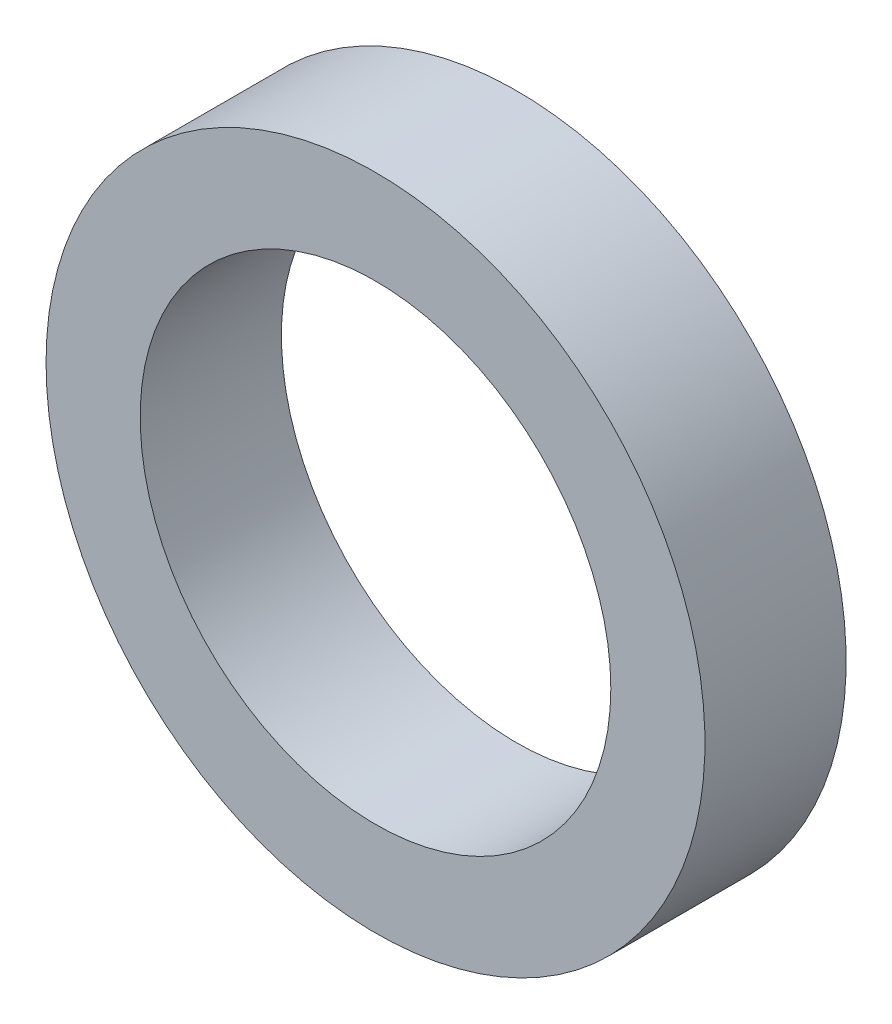
ISO-10303-21;
HEADER;
FILE_DESCRIPTION(('STEP AP214'),'2;1');
FILE_NAME('part.step','',(''),(''),'','','');
FILE_SCHEMA(('AUTOMOTIVE_DESIGN { 1 0 10303 214 1 1 1 1 }'));
ENDSEC;
DATA;
#1=APPLICATION_CONTEXT('core data for automotive mechanical design processes');
#2=APPLICATION_PROTOCOL_DEFINITION('international standard','automotive_design',2000,#1);
#3=PRODUCT_CONTEXT('',#1,'mechanical');
#4=PRODUCT('Part','Part','',(#3));
#5=PRODUCT_RELATED_PRODUCT_CATEGORY('part','',(#4));
#6=PRODUCT_DEFINITION_FORMATION('','',#4);
#7=PRODUCT_DEFINITION_CONTEXT('part definition',#1,'design');
#8=PRODUCT_DEFINITION('design','',#6,#7);
#9=PRODUCT_DEFINITION_SHAPE('','',#8);
#10=(LENGTH_UNIT() NAMED_UNIT(*) SI_UNIT(.MILLI.,.METRE.));
#11=(NAMED_UNIT(*) PLANE_ANGLE_UNIT() SI_UNIT($,.RADIAN.));
#12=(NAMED_UNIT(*) SI_UNIT($,.STERADIAN.) SOLID_ANGLE_UNIT());
#13=UNCERTAINTY_MEASURE_WITH_UNIT(LENGTH_MEASURE(1.E-05),#10,'distance_accuracy_value','');
#14=(GEOMETRIC_REPRESENTATION_CONTEXT(3) GLOBAL_UNCERTAINTY_ASSIGNED_CONTEXT((#13)) GLOBAL_UNIT_ASSIGNED_CONTEXT((#10,
#11,#12)) REPRESENTATION_CONTEXT('',''));
#15=CARTESIAN_POINT('',(0.,0.,0.));
#16=DIRECTION('',(0.,0.,1.));
#17=DIRECTION('',(1.,0.,0.));
#18=AXIS2_PLACEMENT_3D('',#15,#16,#17);
#19=CARTESIAN_POINT('',(0.,0.,2.38125));
#20=DIRECTION('',(0.,0.,1.));
#21=DIRECTION('',(1.,0.,0.));
#22=AXIS2_PLACEMENT_3D('',#19,#20,#21);
#23=PLANE('',#22);
#24=CARTESIAN_POINT('',(0.,0.,2.38125));
#25=DIRECTION('',(0.,0.,1.));
#26=DIRECTION('',(1.,0.,0.));
#27=AXIS2_PLACEMENT_3D('',#24,#25,#26);
#28=CIRCLE('',#27,7.9375);
#29=CARTESIAN_POINT('',(7.9375,0.,2.38125));
#30=VERTEX_POINT('',#29);
#31=EDGE_CURVE('E59',#30,#30,#28,.T.);
#32=ORIENTED_EDGE('',*,*,#31,.F.);
#33=EDGE_LOOP('',(#32));
#34=FACE_BOUND('',#33,.T.);
#35=CARTESIAN_POINT('',(0.,0.,2.38125));
#36=DIRECTION('',(0.,0.,1.));
#37=DIRECTION('',(1.,0.,0.));
#38=AXIS2_PLACEMENT_3D('',#35,#36,#37);
#39=CIRCLE('',#38,11.1125);
#40=CARTESIAN_POINT('',(-11.1125,0.,2.38125));
#41=VERTEX_POINT('',#40);
#42=EDGE_CURVE('E10',#41,#41,#39,.T.);
#43=ORIENTED_EDGE('',*,*,#42,.T.);
#44=EDGE_LOOP('',(#43));
#45=FACE_BOUND('',#44,.T.);
#46=ADVANCED_FACE('F44',(#34,#45),#23,.T.);
#47=CARTESIAN_POINT('',(0.,0.,-2.38125));
#48=DIRECTION('',(0.,0.,1.));
#49=DIRECTION('',(1.,0.,0.));
#50=AXIS2_PLACEMENT_3D('',#47,#48,#49);
#51=PLANE('',#50);
#52=CARTESIAN_POINT('',(0.,0.,-2.38125));
#53=DIRECTION('',(0.,0.,1.));
#54=DIRECTION('',(1.,0.,0.));
#55=AXIS2_PLACEMENT_3D('',#52,#53,#54);
#56=CIRCLE('',#55,7.9375);
#57=CARTESIAN_POINT('',(7.9375,0.,-2.38125));
#58=VERTEX_POINT('',#57);
#59=EDGE_CURVE('E57',#58,#58,#56,.T.);
#60=ORIENTED_EDGE('',*,*,#59,.T.);
#61=EDGE_LOOP('',(#60));
#62=FACE_BOUND('',#61,.T.);
#63=CARTESIAN_POINT('',(0.,0.,-2.38125));
#64=DIRECTION('',(0.,0.,1.));
#65=DIRECTION('',(1.,0.,0.));
#66=AXIS2_PLACEMENT_3D('',#63,#64,#65);
#67=CIRCLE('',#66,11.1125);
#68=CARTESIAN_POINT('',(-11.1125,0.,-2.38125));
#69=VERTEX_POINT('',#68);
#70=EDGE_CURVE('E48',#69,#69,#67,.T.);
#71=ORIENTED_EDGE('',*,*,#70,.F.);
#72=EDGE_LOOP('',(#71));
#73=FACE_BOUND('',#72,.T.);
#74=ADVANCED_FACE('F67',(#62,#73),#51,.F.);
#75=CARTESIAN_POINT('',(0.,0.,2.38125));
#76=DIRECTION('',(0.,0.,-1.));
#77=DIRECTION('',(-1.,0.,0.));
#78=AXIS2_PLACEMENT_3D('',#75,#76,#77);
#79=CYLINDRICAL_SURFACE('',#78,11.1125);
#80=CARTESIAN_POINT('',(-11.1125,0.,2.38125));
#81=CARTESIAN_POINT('',(-11.1125,0.,2.331640625));
#82=CARTESIAN_POINT('',(-11.1125,0.,2.28203125));
#83=CARTESIAN_POINT('',(-11.1125,0.,2.1828125));
#84=CARTESIAN_POINT('',(-11.1125,0.,2.133203125));
#85=CARTESIAN_POINT('',(-11.1125,0.,2.033984375));
#86=CARTESIAN_POINT('',(-11.1125,0.,1.984375));
#87=CARTESIAN_POINT('',(-11.1125,0.,1.88515625));
#88=CARTESIAN_POINT('',(-11.1125,0.,1.835546875));
#89=CARTESIAN_POINT('',(-11.1125,0.,1.736328125));
#90=CARTESIAN_POINT('',(-11.1125,0.,1.68671875));
#91=CARTESIAN_POINT('',(-11.1125,0.,1.5875));
#92=CARTESIAN_POINT('',(-11.1125,0.,1.537890625));
#93=CARTESIAN_POINT('',(-11.1125,0.,1.438671875));
#94=CARTESIAN_POINT('',(-11.1125,0.,1.3890625));
#95=CARTESIAN_POINT('',(-11.1125,0.,1.28984375));
#96=CARTESIAN_POINT('',(-11.1125,0.,1.240234375));
#97=CARTESIAN_POINT('',(-11.1125,0.,1.141015625));
#98=CARTESIAN_POINT('',(-11.1125,0.,1.09140625));
#99=CARTESIAN_POINT('',(-11.1125,0.,0.9921875));
#100=CARTESIAN_POINT('',(-11.1125,0.,0.942578125));
#101=CARTESIAN_POINT('',(-11.1125,0.,0.843359375));
#102=CARTESIAN_POINT('',(-11.1125,0.,0.79375));
#103=CARTESIAN_POINT('',(-11.1125,0.,0.69453125));
#104=CARTESIAN_POINT('',(-11.1125,0.,0.644921875));
#105=CARTESIAN_POINT('',(-11.1125,0.,0.545703125));
#106=CARTESIAN_POINT('',(-11.1125,0.,0.49609375));
#107=CARTESIAN_POINT('',(-11.1125,0.,0.396875));
#108=CARTESIAN_POINT('',(-11.1125,0.,0.347265625));
#109=CARTESIAN_POINT('',(-11.1125,0.,0.248046875));
#110=CARTESIAN_POINT('',(-11.1125,0.,0.1984375));
#111=CARTESIAN_POINT('',(-11.1125,0.,0.09921875));
#112=CARTESIAN_POINT('',(-11.1125,0.,0.049609375));
#113=CARTESIAN_POINT('',(-11.1125,0.,-0.049609375));
#114=CARTESIAN_POINT('',(-11.1125,0.,-0.09921875));
#115=CARTESIAN_POINT('',(-11.1125,0.,-0.1984375));
#116=CARTESIAN_POINT('',(-11.1125,0.,-0.248046875));
#117=CARTESIAN_POINT('',(-11.1125,0.,-0.347265625));
#118=CARTESIAN_POINT('',(-11.1125,0.,-0.396875));
#119=CARTESIAN_POINT('',(-11.1125,0.,-0.49609375));
#120=CARTESIAN_POINT('',(-11.1125,0.,-0.545703125));
#121=CARTESIAN_POINT('',(-11.1125,0.,-0.644921875));
#122=CARTESIAN_POINT('',(-11.1125,0.,-0.69453125));
#123=CARTESIAN_POINT('',(-11.1125,0.,-0.79375));
#124=CARTESIAN_POINT('',(-11.1125,0.,-0.843359375));
#125=CARTESIAN_POINT('',(-11.1125,0.,-0.942578125));
#126=CARTESIAN_POINT('',(-11.1125,0.,-0.9921875));
#127=CARTESIAN_POINT('',(-11.1125,0.,-1.09140625));
#128=CARTESIAN_POINT('',(-11.1125,0.,-1.141015625));
#129=CARTESIAN_POINT('',(-11.1125,0.,-1.240234375));
#130=CARTESIAN_POINT('',(-11.1125,0.,-1.28984375));
#131=CARTESIAN_POINT('',(-11.1125,0.,-1.3890625));
#132=CARTESIAN_POINT('',(-11.1125,0.,-1.438671875));
#133=CARTESIAN_POINT('',(-11.1125,0.,-1.537890625));
#134=CARTESIAN_POINT('',(-11.1125,0.,-1.5875));
#135=CARTESIAN_POINT('',(-11.1125,0.,-1.68671875));
#136=CARTESIAN_POINT('',(-11.1125,0.,-1.736328125));
#137=CARTESIAN_POINT('',(-11.1125,0.,-1.835546875));
#138=CARTESIAN_POINT('',(-11.1125,0.,-1.88515625));
#139=CARTESIAN_POINT('',(-11.1125,0.,-1.984375));
#140=CARTESIAN_POINT('',(-11.1125,0.,-2.033984375));
#141=CARTESIAN_POINT('',(-11.1125,0.,-2.133203125));
#142=CARTESIAN_POINT('',(-11.1125,0.,-2.1828125));
#143=CARTESIAN_POINT('',(-11.1125,0.,-2.28203125));
#144=CARTESIAN_POINT('',(-11.1125,0.,-2.331640625));
#145=CARTESIAN_POINT('',(-11.1125,0.,-2.38125));
#146=B_SPLINE_CURVE_WITH_KNOTS('',3,(#80,#81,#82,#83,#84,#85,#86,#87,#88,#89,#90,#91,#92,#93,
#94,#95,#96,#97,#98,#99,#100,#101,#102,#103,#104,#105,#106,#107,#108,#109,#110,#111,#112,#113,
#114,#115,#116,#117,#118,#119,#120,#121,#122,#123,#124,#125,#126,#127,#128,#129,#130,#131,#132,
#133,#134,#135,#136,#137,#138,#139,#140,#141,#142,#143,#144,#145),.UNSPECIFIED.,.F.,.F.,(4,2,2,
2,2,2,2,2,2,2,2,2,2,2,2,2,2,2,2,2,2,2,2,2,2,2,2,2,2,2,2,2,4),(0.,0.148828125,0.29765625,
0.446484375,0.5953125,0.744140625,0.89296875,1.041796875,1.190625,1.339453125,1.48828125,
1.637109375,1.7859375,1.934765625,2.08359375,2.232421875,2.38125,2.530078125,2.67890625,
2.827734375,2.9765625,3.125390625,3.27421875,3.423046875,3.571875,3.720703125,3.86953125,
4.018359375,4.1671875,4.316015625,4.46484375,4.613671875,4.7625),.UNSPECIFIED.);
#147=EDGE_CURVE('BSEAM46',#41,#69,#146,.T.);
#148=ORIENTED_EDGE('',*,*,#42,.F.);
#149=ORIENTED_EDGE('',*,*,#70,.T.);
#150=ORIENTED_EDGE('',*,*,#147,.T.);
#151=ORIENTED_EDGE('',*,*,#147,.F.);
#152=EDGE_LOOP('',(#148,#150,#149,#151));
#153=FACE_BOUND('',#152,.T.);
#154=ADVANCED_FACE('F46',(#153),#79,.T.);
#155=CARTESIAN_POINT('',(0.,0.,-2.38125));
#156=DIRECTION('',(0.,0.,1.));
#157=DIRECTION('',(1.,0.,0.));
#158=AXIS2_PLACEMENT_3D('',#155,#156,#157);
#159=CYLINDRICAL_SURFACE('',#158,7.9375);
#160=CARTESIAN_POINT('',(7.9375,0.,-2.38125));
#161=CARTESIAN_POINT('',(7.9375,0.,-2.331640625));
#162=CARTESIAN_POINT('',(7.9375,0.,-2.28203125));
#163=CARTESIAN_POINT('',(7.9375,0.,-2.1828125));
#164=CARTESIAN_POINT('',(7.9375,0.,-2.133203125));
#165=CARTESIAN_POINT('',(7.9375,0.,-2.033984375));
#166=CARTESIAN_POINT('',(7.9375,0.,-1.984375));
#167=CARTESIAN_POINT('',(7.9375,0.,-1.88515625));
#168=CARTESIAN_POINT('',(7.9375,0.,-1.835546875));
#169=CARTESIAN_POINT('',(7.9375,0.,-1.736328125));
#170=CARTESIAN_POINT('',(7.9375,0.,-1.68671875));
#171=CARTESIAN_POINT('',(7.9375,0.,-1.5875));
#172=CARTESIAN_POINT('',(7.9375,0.,-1.537890625));
#173=CARTESIAN_POINT('',(7.9375,0.,-1.438671875));
#174=CARTESIAN_POINT('',(7.9375,0.,-1.3890625));
#175=CARTESIAN_POINT('',(7.9375,0.,-1.28984375));
#176=CARTESIAN_POINT('',(7.9375,0.,-1.240234375));
#177=CARTESIAN_POINT('',(7.9375,0.,-1.141015625));
#178=CARTESIAN_POINT('',(7.9375,0.,-1.09140625));
#179=CARTESIAN_POINT('',(7.9375,0.,-0.9921875));
#180=CARTESIAN_POINT('',(7.9375,0.,-0.942578125));
#181=CARTESIAN_POINT('',(7.9375,0.,-0.843359375));
#182=CARTESIAN_POINT('',(7.9375,0.,-0.79375));
#183=CARTESIAN_POINT('',(7.9375,0.,-0.69453125));
#184=CARTESIAN_POINT('',(7.9375,0.,-0.644921875));
#185=CARTESIAN_POINT('',(7.9375,0.,-0.545703125));
#186=CARTESIAN_POINT('',(7.9375,0.,-0.49609375));
#187=CARTESIAN_POINT('',(7.9375,0.,-0.396875));
#188=CARTESIAN_POINT('',(7.9375,0.,-0.347265625));
#189=CARTESIAN_POINT('',(7.9375,0.,-0.248046875));
#190=CARTESIAN_POINT('',(7.9375,0.,-0.1984375));
#191=CARTESIAN_POINT('',(7.9375,0.,-0.09921875));
#192=CARTESIAN_POINT('',(7.9375,0.,-0.049609375));
#193=CARTESIAN_POINT('',(7.9375,0.,0.049609375));
#194=CARTESIAN_POINT('',(7.9375,0.,0.09921875));
#195=CARTESIAN_POINT('',(7.9375,0.,0.1984375));
#196=CARTESIAN_POINT('',(7.9375,0.,0.248046875));
#197=CARTESIAN_POINT('',(7.9375,0.,0.347265625));
#198=CARTESIAN_POINT('',(7.9375,0.,0.396875));
#199=CARTESIAN_POINT('',(7.9375,0.,0.49609375));
#200=CARTESIAN_POINT('',(7.9375,0.,0.545703125));
#201=CARTESIAN_POINT('',(7.9375,0.,0.644921875));
#202=CARTESIAN_POINT('',(7.9375,0.,0.69453125));
#203=CARTESIAN_POINT('',(7.9375,0.,0.79375));
#204=CARTESIAN_POINT('',(7.9375,0.,0.843359375));
#205=CARTESIAN_POINT('',(7.9375,0.,0.942578125));
#206=CARTESIAN_POINT('',(7.9375,0.,0.9921875));
#207=CARTESIAN_POINT('',(7.9375,0.,1.09140625));
#208=CARTESIAN_POINT('',(7.9375,0.,1.141015625));
#209=CARTESIAN_POINT('',(7.9375,0.,1.240234375));
#210=CARTESIAN_POINT('',(7.9375,0.,1.28984375));
#211=CARTESIAN_POINT('',(7.9375,0.,1.3890625));
#212=CARTESIAN_POINT('',(7.9375,0.,1.438671875));
#213=CARTESIAN_POINT('',(7.9375,0.,1.537890625));
#214=CARTESIAN_POINT('',(7.9375,0.,1.5875));
#215=CARTESIAN_POINT('',(7.9375,0.,1.68671875));
#216=CARTESIAN_POINT('',(7.9375,0.,1.736328125));
#217=CARTESIAN_POINT('',(7.9375,0.,1.835546875));
#218=CARTESIAN_POINT('',(7.9375,0.,1.88515625));
#219=CARTESIAN_POINT('',(7.9375,0.,1.984375));
#220=CARTESIAN_POINT('',(7.9375,0.,2.033984375));
#221=CARTESIAN_POINT('',(7.9375,0.,2.133203125));
#222=CARTESIAN_POINT('',(7.9375,0.,2.1828125));
#223=CARTESIAN_POINT('',(7.9375,0.,2.28203125));
#224=CARTESIAN_POINT('',(7.9375,0.,2.331640625));
#225=CARTESIAN_POINT('',(7.9375,0.,2.38125));
#226=B_SPLINE_CURVE_WITH_KNOTS('',3,(#160,#161,#162,#163,#164,#165,#166,#167,#168,#169,#170,
#171,#172,#173,#174,#175,#176,#177,#178,#179,#180,#181,#182,#183,#184,#185,#186,#187,#188,#189,
#190,#191,#192,#193,#194,#195,#196,#197,#198,#199,#200,#201,#202,#203,#204,#205,#206,#207,#208,
#209,#210,#211,#212,#213,#214,#215,#216,#217,#218,#219,#220,#221,#222,#223,#224,#225),
.UNSPECIFIED.,.F.,.F.,(4,2,2,2,2,2,2,2,2,2,2,2,2,2,2,2,2,2,2,2,2,2,2,2,2,2,2,2,2,2,2,2,4),(0.,
0.148828125,0.29765625,0.446484375,0.5953125,0.744140625,0.89296875,1.041796875,1.190625,
1.339453125,1.48828125,1.637109375,1.7859375,1.934765625,2.08359375,2.232421875,2.38125,
2.530078125,2.67890625,2.827734375,2.9765625,3.125390625,3.27421875,3.423046875,3.571875,
3.720703125,3.86953125,4.018359375,4.1671875,4.316015625,4.46484375,4.613671875,4.7625),.UNSPECIFIED.);
#227=EDGE_CURVE('BSEAM70',#58,#30,#226,.T.);
#228=ORIENTED_EDGE('',*,*,#59,.F.);
#229=ORIENTED_EDGE('',*,*,#31,.T.);
#230=ORIENTED_EDGE('',*,*,#227,.T.);
#231=ORIENTED_EDGE('',*,*,#227,.F.);
#232=EDGE_LOOP('',(#228,#230,#229,#231));
#233=FACE_BOUND('',#232,.T.);
#234=ADVANCED_FACE('F70',(#233),#159,.F.);
#235=CLOSED_SHELL('',(#46,#74,#154,#234));
#236=MANIFOLD_SOLID_BREP('B2',#235);
#237=ADVANCED_BREP_SHAPE_REPRESENTATION('',(#18,#236),#14);
#238=SHAPE_DEFINITION_REPRESENTATION(#9,#237);
ENDSEC;
END-ISO-10303-21;
